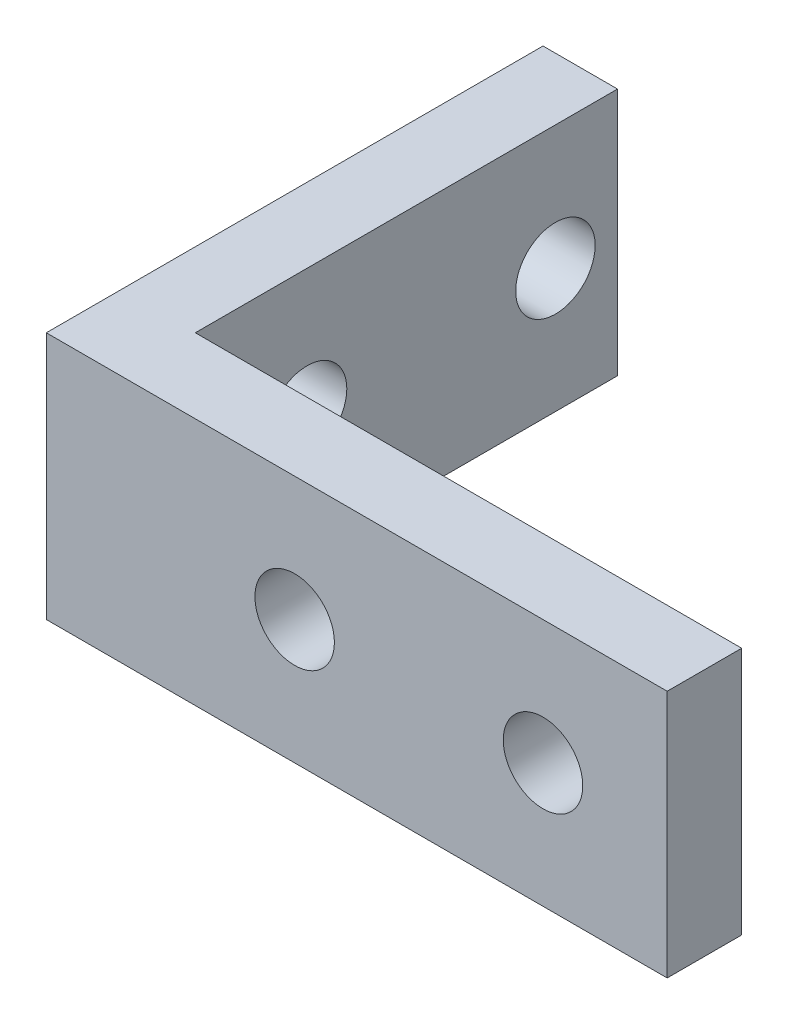
ISO-10303-21;
HEADER;
FILE_DESCRIPTION(('STEP AP214'),'2;1');
FILE_NAME('part.step','',(''),(''),'','','');
FILE_SCHEMA(('AUTOMOTIVE_DESIGN { 1 0 10303 214 1 1 1 1 }'));
ENDSEC;
DATA;
#1=APPLICATION_CONTEXT('core data for automotive mechanical design processes');
#2=APPLICATION_PROTOCOL_DEFINITION('international standard','automotive_design',2000,#1);
#3=PRODUCT_CONTEXT('',#1,'mechanical');
#4=PRODUCT('Part','Part','',(#3));
#5=PRODUCT_RELATED_PRODUCT_CATEGORY('part','',(#4));
#6=PRODUCT_DEFINITION_FORMATION('','',#4);
#7=PRODUCT_DEFINITION_CONTEXT('part definition',#1,'design');
#8=PRODUCT_DEFINITION('design','',#6,#7);
#9=PRODUCT_DEFINITION_SHAPE('','',#8);
#10=(LENGTH_UNIT() NAMED_UNIT(*) SI_UNIT(.MILLI.,.METRE.));
#11=(NAMED_UNIT(*) PLANE_ANGLE_UNIT() SI_UNIT($,.RADIAN.));
#12=(NAMED_UNIT(*) SI_UNIT($,.STERADIAN.) SOLID_ANGLE_UNIT());
#13=UNCERTAINTY_MEASURE_WITH_UNIT(LENGTH_MEASURE(1.E-05),#10,'distance_accuracy_value','');
#14=(GEOMETRIC_REPRESENTATION_CONTEXT(3) GLOBAL_UNCERTAINTY_ASSIGNED_CONTEXT((#13)) GLOBAL_UNIT_ASSIGNED_CONTEXT((#10,
#11,#12)) REPRESENTATION_CONTEXT('',''));
#15=CARTESIAN_POINT('',(0.,0.,0.));
#16=DIRECTION('',(0.,0.,1.));
#17=DIRECTION('',(1.,0.,0.));
#18=AXIS2_PLACEMENT_3D('',#15,#16,#17);
#19=CARTESIAN_POINT('',(25.,10.,0.));
#20=DIRECTION('',(0.,0.,-1.));
#21=DIRECTION('',(-1.,0.,0.));
#22=AXIS2_PLACEMENT_3D('',#19,#20,#21);
#23=PLANE('',#22);
#24=CARTESIAN_POINT('',(20.,5.,0.));
#25=DIRECTION('',(0.,0.,1.));
#26=DIRECTION('',(1.,0.,0.));
#27=AXIS2_PLACEMENT_3D('',#24,#25,#26);
#28=CIRCLE('',#27,1.6);
#29=CARTESIAN_POINT('',(21.6,5.,0.));
#30=VERTEX_POINT('',#29);
#31=EDGE_CURVE('E139',#30,#30,#28,.T.);
#32=ORIENTED_EDGE('',*,*,#31,.F.);
#33=EDGE_LOOP('',(#32));
#34=FACE_BOUND('',#33,.T.);
#35=CARTESIAN_POINT('',(10.,5.,0.));
#36=DIRECTION('',(0.,0.,1.));
#37=DIRECTION('',(1.,0.,0.));
#38=AXIS2_PLACEMENT_3D('',#35,#36,#37);
#39=CIRCLE('',#38,1.6);
#40=CARTESIAN_POINT('',(11.6,5.,0.));
#41=VERTEX_POINT('',#40);
#42=EDGE_CURVE('E147',#41,#41,#39,.T.);
#43=ORIENTED_EDGE('',*,*,#42,.F.);
#44=EDGE_LOOP('',(#43));
#45=FACE_BOUND('',#44,.T.);
#46=DIRECTION('',(1.,0.,0.));
#47=VECTOR('',#46,1.);
#48=CARTESIAN_POINT('',(25.,0.,0.));
#49=LINE('',#48,#47);
#50=CARTESIAN_POINT('',(0.,0.,0.));
#51=VERTEX_POINT('',#50);
#52=CARTESIAN_POINT('',(25.,0.,0.));
#53=VERTEX_POINT('',#52);
#54=EDGE_CURVE('E119',#51,#53,#49,.T.);
#55=ORIENTED_EDGE('',*,*,#54,.T.);
#56=DIRECTION('',(0.,-1.,0.));
#57=VECTOR('',#56,1.);
#58=CARTESIAN_POINT('',(25.,10.,0.));
#59=LINE('',#58,#57);
#60=CARTESIAN_POINT('',(25.,10.,0.));
#61=VERTEX_POINT('',#60);
#62=EDGE_CURVE('E11',#61,#53,#59,.T.);
#63=ORIENTED_EDGE('',*,*,#62,.F.);
#64=DIRECTION('',(1.,0.,0.));
#65=VECTOR('',#64,1.);
#66=CARTESIAN_POINT('',(25.,10.,0.));
#67=LINE('',#66,#65);
#68=CARTESIAN_POINT('',(0.,10.,0.));
#69=VERTEX_POINT('',#68);
#70=EDGE_CURVE('E130',#69,#61,#67,.T.);
#71=ORIENTED_EDGE('',*,*,#70,.F.);
#72=DIRECTION('',(0.,-1.,0.));
#73=VECTOR('',#72,1.);
#74=CARTESIAN_POINT('',(0.,10.,0.));
#75=LINE('',#74,#73);
#76=EDGE_CURVE('E115',#69,#51,#75,.T.);
#77=ORIENTED_EDGE('',*,*,#76,.T.);
#78=EDGE_LOOP('',(#55,#63,#71,#77));
#79=FACE_BOUND('',#78,.T.);
#80=ADVANCED_FACE('F33',(#34,#45,#79),#23,.F.);
#81=CARTESIAN_POINT('',(25.,10.,-3.));
#82=DIRECTION('',(-1.,0.,0.));
#83=DIRECTION('',(0.,0.,1.));
#84=AXIS2_PLACEMENT_3D('',#81,#82,#83);
#85=PLANE('',#84);
#86=DIRECTION('',(0.,0.,-1.));
#87=VECTOR('',#86,1.);
#88=CARTESIAN_POINT('',(25.,0.,-3.));
#89=LINE('',#88,#87);
#90=CARTESIAN_POINT('',(25.,0.,-3.));
#91=VERTEX_POINT('',#90);
#92=EDGE_CURVE('E122',#53,#91,#89,.T.);
#93=ORIENTED_EDGE('',*,*,#92,.T.);
#94=DIRECTION('',(0.,-1.,0.));
#95=VECTOR('',#94,1.);
#96=CARTESIAN_POINT('',(25.,10.,-3.));
#97=LINE('',#96,#95);
#98=CARTESIAN_POINT('',(25.,10.,-3.));
#99=VERTEX_POINT('',#98);
#100=EDGE_CURVE('E42',#99,#91,#97,.T.);
#101=ORIENTED_EDGE('',*,*,#100,.F.);
#102=DIRECTION('',(0.,0.,-1.));
#103=VECTOR('',#102,1.);
#104=CARTESIAN_POINT('',(25.,10.,-3.));
#105=LINE('',#104,#103);
#106=EDGE_CURVE('E88',#61,#99,#105,.T.);
#107=ORIENTED_EDGE('',*,*,#106,.F.);
#108=ORIENTED_EDGE('',*,*,#62,.T.);
#109=EDGE_LOOP('',(#93,#101,#107,#108));
#110=FACE_BOUND('',#109,.T.);
#111=ADVANCED_FACE('F163',(#110),#85,.F.);
#112=CARTESIAN_POINT('',(3.,10.,-3.));
#113=DIRECTION('',(0.,0.,1.));
#114=DIRECTION('',(1.,0.,0.));
#115=AXIS2_PLACEMENT_3D('',#112,#113,#114);
#116=PLANE('',#115);
#117=CARTESIAN_POINT('',(20.,5.,-3.));
#118=DIRECTION('',(0.,0.,1.));
#119=DIRECTION('',(1.,0.,0.));
#120=AXIS2_PLACEMENT_3D('',#117,#118,#119);
#121=CIRCLE('',#120,1.6);
#122=CARTESIAN_POINT('',(21.6,5.,-3.));
#123=VERTEX_POINT('',#122);
#124=EDGE_CURVE('E123',#123,#123,#121,.T.);
#125=ORIENTED_EDGE('',*,*,#124,.T.);
#126=EDGE_LOOP('',(#125));
#127=FACE_BOUND('',#126,.T.);
#128=CARTESIAN_POINT('',(10.,5.,-3.));
#129=DIRECTION('',(0.,0.,1.));
#130=DIRECTION('',(1.,0.,0.));
#131=AXIS2_PLACEMENT_3D('',#128,#129,#130);
#132=CIRCLE('',#131,1.6);
#133=CARTESIAN_POINT('',(11.6,5.,-3.));
#134=VERTEX_POINT('',#133);
#135=EDGE_CURVE('E136',#134,#134,#132,.T.);
#136=ORIENTED_EDGE('',*,*,#135,.T.);
#137=EDGE_LOOP('',(#136));
#138=FACE_BOUND('',#137,.T.);
#139=DIRECTION('',(-1.,0.,0.));
#140=VECTOR('',#139,1.);
#141=CARTESIAN_POINT('',(3.,0.,-3.));
#142=LINE('',#141,#140);
#143=CARTESIAN_POINT('',(3.,0.,-3.));
#144=VERTEX_POINT('',#143);
#145=EDGE_CURVE('E125',#91,#144,#142,.T.);
#146=ORIENTED_EDGE('',*,*,#145,.T.);
#147=DIRECTION('',(0.,-1.,0.));
#148=VECTOR('',#147,1.);
#149=CARTESIAN_POINT('',(3.,10.,-3.));
#150=LINE('',#149,#148);
#151=CARTESIAN_POINT('',(3.,10.,-3.));
#152=VERTEX_POINT('',#151);
#153=EDGE_CURVE('E110',#152,#144,#150,.T.);
#154=ORIENTED_EDGE('',*,*,#153,.F.);
#155=DIRECTION('',(-1.,0.,0.));
#156=VECTOR('',#155,1.);
#157=CARTESIAN_POINT('',(3.,10.,-3.));
#158=LINE('',#157,#156);
#159=EDGE_CURVE('E101',#99,#152,#158,.T.);
#160=ORIENTED_EDGE('',*,*,#159,.F.);
#161=ORIENTED_EDGE('',*,*,#100,.T.);
#162=EDGE_LOOP('',(#146,#154,#160,#161));
#163=FACE_BOUND('',#162,.T.);
#164=ADVANCED_FACE('F166',(#127,#138,#163),#116,.F.);
#165=CARTESIAN_POINT('',(3.,10.,-20.));
#166=DIRECTION('',(-1.,0.,0.));
#167=DIRECTION('',(0.,0.,1.));
#168=AXIS2_PLACEMENT_3D('',#165,#166,#167);
#169=PLANE('',#168);
#170=CARTESIAN_POINT('',(3.,5.,-7.5));
#171=DIRECTION('',(1.,0.,0.));
#172=DIRECTION('',(0.,0.,-1.));
#173=AXIS2_PLACEMENT_3D('',#170,#171,#172);
#174=CIRCLE('',#173,1.6);
#175=CARTESIAN_POINT('',(3.,5.,-9.09999999999999));
#176=VERTEX_POINT('',#175);
#177=EDGE_CURVE('E143',#176,#176,#174,.T.);
#178=ORIENTED_EDGE('',*,*,#177,.F.);
#179=EDGE_LOOP('',(#178));
#180=FACE_BOUND('',#179,.T.);
#181=CARTESIAN_POINT('',(3.,5.,-17.5));
#182=DIRECTION('',(1.,0.,0.));
#183=DIRECTION('',(0.,0.,-1.));
#184=AXIS2_PLACEMENT_3D('',#181,#182,#183);
#185=CIRCLE('',#184,1.6);
#186=CARTESIAN_POINT('',(3.,5.,-19.1));
#187=VERTEX_POINT('',#186);
#188=EDGE_CURVE('E149',#187,#187,#185,.T.);
#189=ORIENTED_EDGE('',*,*,#188,.F.);
#190=EDGE_LOOP('',(#189));
#191=FACE_BOUND('',#190,.T.);
#192=DIRECTION('',(0.,0.,-1.));
#193=VECTOR('',#192,1.);
#194=CARTESIAN_POINT('',(3.,0.,-20.));
#195=LINE('',#194,#193);
#196=CARTESIAN_POINT('',(3.,0.,-20.));
#197=VERTEX_POINT('',#196);
#198=EDGE_CURVE('E109',#144,#197,#195,.T.);
#199=ORIENTED_EDGE('',*,*,#198,.T.);
#200=DIRECTION('',(0.,-1.,0.));
#201=VECTOR('',#200,1.);
#202=CARTESIAN_POINT('',(3.,10.,-20.));
#203=LINE('',#202,#201);
#204=CARTESIAN_POINT('',(3.,10.,-20.));
#205=VERTEX_POINT('',#204);
#206=EDGE_CURVE('E106',#205,#197,#203,.T.);
#207=ORIENTED_EDGE('',*,*,#206,.F.);
#208=DIRECTION('',(0.,0.,-1.));
#209=VECTOR('',#208,1.);
#210=CARTESIAN_POINT('',(3.,10.,-20.));
#211=LINE('',#210,#209);
#212=EDGE_CURVE('E95',#152,#205,#211,.T.);
#213=ORIENTED_EDGE('',*,*,#212,.F.);
#214=ORIENTED_EDGE('',*,*,#153,.T.);
#215=EDGE_LOOP('',(#199,#207,#213,#214));
#216=FACE_BOUND('',#215,.T.);
#217=ADVANCED_FACE('F107',(#180,#191,#216),#169,.F.);
#218=CARTESIAN_POINT('',(0.,10.,-20.));
#219=DIRECTION('',(0.,0.,1.));
#220=DIRECTION('',(1.,0.,0.));
#221=AXIS2_PLACEMENT_3D('',#218,#219,#220);
#222=PLANE('',#221);
#223=DIRECTION('',(-1.,0.,0.));
#224=VECTOR('',#223,1.);
#225=CARTESIAN_POINT('',(0.,0.,-20.));
#226=LINE('',#225,#224);
#227=CARTESIAN_POINT('',(0.,0.,-20.));
#228=VERTEX_POINT('',#227);
#229=EDGE_CURVE('E74',#197,#228,#226,.T.);
#230=ORIENTED_EDGE('',*,*,#229,.T.);
#231=DIRECTION('',(0.,-1.,0.));
#232=VECTOR('',#231,1.);
#233=CARTESIAN_POINT('',(0.,10.,-20.));
#234=LINE('',#233,#232);
#235=CARTESIAN_POINT('',(0.,10.,-20.));
#236=VERTEX_POINT('',#235);
#237=EDGE_CURVE('E111',#236,#228,#234,.T.);
#238=ORIENTED_EDGE('',*,*,#237,.F.);
#239=DIRECTION('',(-1.,0.,0.));
#240=VECTOR('',#239,1.);
#241=CARTESIAN_POINT('',(0.,10.,-20.));
#242=LINE('',#241,#240);
#243=EDGE_CURVE('E99',#205,#236,#242,.T.);
#244=ORIENTED_EDGE('',*,*,#243,.F.);
#245=ORIENTED_EDGE('',*,*,#206,.T.);
#246=EDGE_LOOP('',(#230,#238,#244,#245));
#247=FACE_BOUND('',#246,.T.);
#248=ADVANCED_FACE('F113',(#247),#222,.F.);
#249=CARTESIAN_POINT('',(0.,10.,0.));
#250=DIRECTION('',(1.,0.,0.));
#251=DIRECTION('',(0.,0.,-1.));
#252=AXIS2_PLACEMENT_3D('',#249,#250,#251);
#253=PLANE('',#252);
#254=CARTESIAN_POINT('',(0.,5.,-7.5));
#255=DIRECTION('',(1.,0.,0.));
#256=DIRECTION('',(0.,0.,-1.));
#257=AXIS2_PLACEMENT_3D('',#254,#255,#256);
#258=CIRCLE('',#257,1.6);
#259=CARTESIAN_POINT('',(0.,5.,-9.09999999999999));
#260=VERTEX_POINT('',#259);
#261=EDGE_CURVE('E36',#260,#260,#258,.T.);
#262=ORIENTED_EDGE('',*,*,#261,.T.);
#263=EDGE_LOOP('',(#262));
#264=FACE_BOUND('',#263,.T.);
#265=CARTESIAN_POINT('',(0.,5.,-17.5));
#266=DIRECTION('',(1.,0.,0.));
#267=DIRECTION('',(0.,0.,-1.));
#268=AXIS2_PLACEMENT_3D('',#265,#266,#267);
#269=CIRCLE('',#268,1.6);
#270=CARTESIAN_POINT('',(0.,5.,-19.1));
#271=VERTEX_POINT('',#270);
#272=EDGE_CURVE('E141',#271,#271,#269,.T.);
#273=ORIENTED_EDGE('',*,*,#272,.T.);
#274=EDGE_LOOP('',(#273));
#275=FACE_BOUND('',#274,.T.);
#276=DIRECTION('',(0.,0.,1.));
#277=VECTOR('',#276,1.);
#278=CARTESIAN_POINT('',(0.,0.,0.));
#279=LINE('',#278,#277);
#280=EDGE_CURVE('E80',#228,#51,#279,.T.);
#281=ORIENTED_EDGE('',*,*,#280,.T.);
#282=ORIENTED_EDGE('',*,*,#76,.F.);
#283=DIRECTION('',(0.,0.,1.));
#284=VECTOR('',#283,1.);
#285=CARTESIAN_POINT('',(0.,10.,0.));
#286=LINE('',#285,#284);
#287=EDGE_CURVE('E51',#236,#69,#286,.T.);
#288=ORIENTED_EDGE('',*,*,#287,.F.);
#289=ORIENTED_EDGE('',*,*,#237,.T.);
#290=EDGE_LOOP('',(#281,#282,#288,#289));
#291=FACE_BOUND('',#290,.T.);
#292=ADVANCED_FACE('F171',(#264,#275,#291),#253,.F.);
#293=CARTESIAN_POINT('',(0.,10.,0.));
#294=DIRECTION('',(0.,-1.,0.));
#295=DIRECTION('',(0.,0.,-1.));
#296=AXIS2_PLACEMENT_3D('',#293,#294,#295);
#297=PLANE('',#296);
#298=ORIENTED_EDGE('',*,*,#70,.T.);
#299=ORIENTED_EDGE('',*,*,#106,.T.);
#300=ORIENTED_EDGE('',*,*,#159,.T.);
#301=ORIENTED_EDGE('',*,*,#212,.T.);
#302=ORIENTED_EDGE('',*,*,#243,.T.);
#303=ORIENTED_EDGE('',*,*,#287,.T.);
#304=EDGE_LOOP('',(#298,#299,#300,#301,#302,#303));
#305=FACE_BOUND('',#304,.T.);
#306=ADVANCED_FACE('F97',(#305),#297,.F.);
#307=CARTESIAN_POINT('',(0.,0.,0.));
#308=DIRECTION('',(0.,-1.,0.));
#309=DIRECTION('',(0.,0.,-1.));
#310=AXIS2_PLACEMENT_3D('',#307,#308,#309);
#311=PLANE('',#310);
#312=ORIENTED_EDGE('',*,*,#54,.F.);
#313=ORIENTED_EDGE('',*,*,#280,.F.);
#314=ORIENTED_EDGE('',*,*,#229,.F.);
#315=ORIENTED_EDGE('',*,*,#198,.F.);
#316=ORIENTED_EDGE('',*,*,#145,.F.);
#317=ORIENTED_EDGE('',*,*,#92,.F.);
#318=EDGE_LOOP('',(#312,#313,#314,#315,#316,#317));
#319=FACE_BOUND('',#318,.T.);
#320=ADVANCED_FACE('F169',(#319),#311,.T.);
#321=CARTESIAN_POINT('',(10.,5.,-10.));
#322=DIRECTION('',(0.,0.,1.));
#323=DIRECTION('',(1.,0.,0.));
#324=AXIS2_PLACEMENT_3D('',#321,#322,#323);
#325=CYLINDRICAL_SURFACE('',#324,1.6);
#326=ORIENTED_EDGE('',*,*,#42,.T.);
#327=EDGE_LOOP('',(#326));
#328=FACE_BOUND('',#327,.T.);
#329=ORIENTED_EDGE('',*,*,#135,.F.);
#330=EDGE_LOOP('',(#329));
#331=FACE_BOUND('',#330,.T.);
#332=ADVANCED_FACE('F191',(#328,#331),#325,.F.);
#333=CARTESIAN_POINT('',(20.,5.,-10.));
#334=DIRECTION('',(0.,0.,1.));
#335=DIRECTION('',(1.,0.,0.));
#336=AXIS2_PLACEMENT_3D('',#333,#334,#335);
#337=CYLINDRICAL_SURFACE('',#336,1.6);
#338=ORIENTED_EDGE('',*,*,#31,.T.);
#339=EDGE_LOOP('',(#338));
#340=FACE_BOUND('',#339,.T.);
#341=ORIENTED_EDGE('',*,*,#124,.F.);
#342=EDGE_LOOP('',(#341));
#343=FACE_BOUND('',#342,.T.);
#344=ADVANCED_FACE('F194',(#340,#343),#337,.F.);
#345=CARTESIAN_POINT('',(-7.,5.,-17.5));
#346=DIRECTION('',(1.,0.,0.));
#347=DIRECTION('',(0.,0.,-1.));
#348=AXIS2_PLACEMENT_3D('',#345,#346,#347);
#349=CYLINDRICAL_SURFACE('',#348,1.6);
#350=ORIENTED_EDGE('',*,*,#188,.T.);
#351=EDGE_LOOP('',(#350));
#352=FACE_BOUND('',#351,.T.);
#353=ORIENTED_EDGE('',*,*,#272,.F.);
#354=EDGE_LOOP('',(#353));
#355=FACE_BOUND('',#354,.T.);
#356=ADVANCED_FACE('F209',(#352,#355),#349,.F.);
#357=CARTESIAN_POINT('',(-7.,5.,-7.5));
#358=DIRECTION('',(1.,0.,0.));
#359=DIRECTION('',(0.,0.,-1.));
#360=AXIS2_PLACEMENT_3D('',#357,#358,#359);
#361=CYLINDRICAL_SURFACE('',#360,1.6);
#362=ORIENTED_EDGE('',*,*,#177,.T.);
#363=EDGE_LOOP('',(#362));
#364=FACE_BOUND('',#363,.T.);
#365=ORIENTED_EDGE('',*,*,#261,.F.);
#366=EDGE_LOOP('',(#365));
#367=FACE_BOUND('',#366,.T.);
#368=ADVANCED_FACE('F215',(#364,#367),#361,.F.);
#369=CLOSED_SHELL('',(#80,#111,#164,#217,#248,#292,#306,#320,#332,#344,#356,#368));
#370=MANIFOLD_SOLID_BREP('B2',#369);
#371=ADVANCED_BREP_SHAPE_REPRESENTATION('',(#18,#370),#14);
#372=SHAPE_DEFINITION_REPRESENTATION(#9,#371);
ENDSEC;
END-ISO-10303-21;
